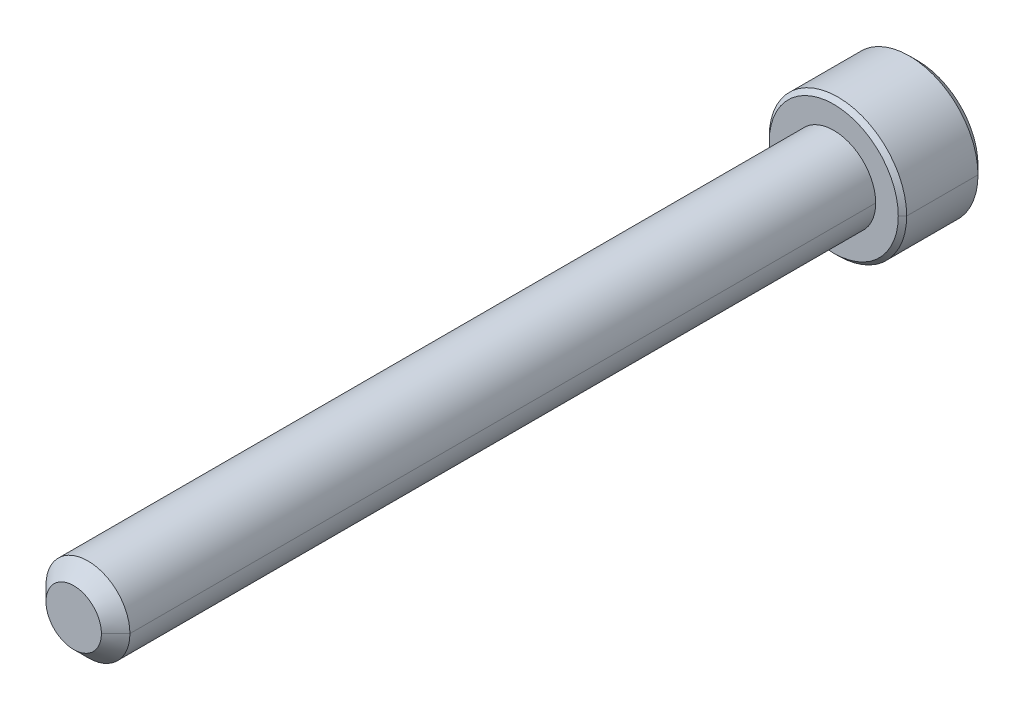
ISO-10303-21;
HEADER;
FILE_DESCRIPTION(('STEP AP214'),'2;1');
FILE_NAME('part.step','',(''),(''),'','','');
FILE_SCHEMA(('AUTOMOTIVE_DESIGN { 1 0 10303 214 1 1 1 1 }'));
ENDSEC;
DATA;
#1=APPLICATION_CONTEXT('core data for automotive mechanical design processes');
#2=APPLICATION_PROTOCOL_DEFINITION('international standard','automotive_design',2000,#1);
#3=PRODUCT_CONTEXT('',#1,'mechanical');
#4=PRODUCT('Part','Part','',(#3));
#5=PRODUCT_RELATED_PRODUCT_CATEGORY('part','',(#4));
#6=PRODUCT_DEFINITION_FORMATION('','',#4);
#7=PRODUCT_DEFINITION_CONTEXT('part definition',#1,'design');
#8=PRODUCT_DEFINITION('design','',#6,#7);
#9=PRODUCT_DEFINITION_SHAPE('','',#8);
#10=(LENGTH_UNIT() NAMED_UNIT(*) SI_UNIT(.MILLI.,.METRE.));
#11=(NAMED_UNIT(*) PLANE_ANGLE_UNIT() SI_UNIT($,.RADIAN.));
#12=(NAMED_UNIT(*) SI_UNIT($,.STERADIAN.) SOLID_ANGLE_UNIT());
#13=UNCERTAINTY_MEASURE_WITH_UNIT(LENGTH_MEASURE(1.E-05),#10,'distance_accuracy_value','');
#14=(GEOMETRIC_REPRESENTATION_CONTEXT(3) GLOBAL_UNCERTAINTY_ASSIGNED_CONTEXT((#13)) GLOBAL_UNIT_ASSIGNED_CONTEXT((#10,
#11,#12)) REPRESENTATION_CONTEXT('',''));
#15=CARTESIAN_POINT('',(0.,0.,0.));
#16=DIRECTION('',(0.,0.,1.));
#17=DIRECTION('',(1.,0.,0.));
#18=AXIS2_PLACEMENT_3D('',#15,#16,#17);
#19=CARTESIAN_POINT('',(0.,0.,-31.92526));
#20=DIRECTION('',(0.,0.,-1.));
#21=DIRECTION('',(-1.,0.,0.));
#22=AXIS2_PLACEMENT_3D('',#19,#20,#21);
#23=CONICAL_SURFACE('',#22,2.8702,0.785398163397448);
#24=DIRECTION('',(0.707106781186547,0.,-0.707106781186548));
#25=VECTOR('',#24,1.);
#26=CARTESIAN_POINT('',(2.8702,0.,-31.92526));
#27=LINE('',#26,#25);
#28=CARTESIAN_POINT('',(2.69494,0.,-31.75));
#29=VERTEX_POINT('',#28);
#30=CARTESIAN_POINT('',(2.8702,0.,-31.92526));
#31=VERTEX_POINT('',#30);
#32=EDGE_CURVE('E162',#29,#31,#27,.T.);
#33=ORIENTED_EDGE('',*,*,#32,.F.);
#34=CARTESIAN_POINT('',(0.,0.,-31.75));
#35=DIRECTION('',(0.,0.,1.));
#36=DIRECTION('',(-1.,0.,0.));
#37=AXIS2_PLACEMENT_3D('',#34,#35,#36);
#38=CIRCLE('',#37,2.69494);
#39=CARTESIAN_POINT('',(-2.69494,0.,-31.75));
#40=VERTEX_POINT('',#39);
#41=EDGE_CURVE('E274',#40,#29,#38,.T.);
#42=ORIENTED_EDGE('',*,*,#41,.F.);
#43=DIRECTION('',(-0.707106781186547,0.,-0.707106781186548));
#44=VECTOR('',#43,1.);
#45=CARTESIAN_POINT('',(-2.8702,0.,-31.92526));
#46=LINE('',#45,#44);
#47=CARTESIAN_POINT('',(-2.8702,0.,-31.92526));
#48=VERTEX_POINT('',#47);
#49=EDGE_CURVE('E165',#40,#48,#46,.T.);
#50=ORIENTED_EDGE('',*,*,#49,.T.);
#51=CARTESIAN_POINT('',(0.,0.,-31.92526));
#52=DIRECTION('',(0.,0.,-1.));
#53=DIRECTION('',(-1.,0.,0.));
#54=AXIS2_PLACEMENT_3D('',#51,#52,#53);
#55=CIRCLE('',#54,2.8702);
#56=EDGE_CURVE('E159',#31,#48,#55,.T.);
#57=ORIENTED_EDGE('',*,*,#56,.F.);
#58=EDGE_LOOP('',(#33,#42,#50,#57));
#59=FACE_BOUND('',#58,.T.);
#60=ADVANCED_FACE('F17',(#59),#23,.T.);
#61=CARTESIAN_POINT('',(0.,0.,-35.2552));
#62=DIRECTION('',(0.,0.,1.));
#63=DIRECTION('',(1.,0.,0.));
#64=AXIS2_PLACEMENT_3D('',#61,#62,#63);
#65=CONICAL_SURFACE('',#64,2.51968,0.785398163397453);
#66=DIRECTION('',(-0.707106781186552,0.,0.707106781186544));
#67=VECTOR('',#66,1.);
#68=CARTESIAN_POINT('',(-2.51968,0.,-35.2552));
#69=LINE('',#68,#67);
#70=CARTESIAN_POINT('',(-2.51968,0.,-35.2552));
#71=VERTEX_POINT('',#70);
#72=CARTESIAN_POINT('',(-2.8702,0.,-34.90468));
#73=VERTEX_POINT('',#72);
#74=EDGE_CURVE('E227',#71,#73,#69,.T.);
#75=ORIENTED_EDGE('',*,*,#74,.F.);
#76=CARTESIAN_POINT('',(0.,0.,-35.2552));
#77=DIRECTION('',(0.,0.,-1.));
#78=DIRECTION('',(-1.,0.,0.));
#79=AXIS2_PLACEMENT_3D('',#76,#77,#78);
#80=CIRCLE('',#79,2.51968);
#81=CARTESIAN_POINT('',(2.51968,0.,-35.2552));
#82=VERTEX_POINT('',#81);
#83=EDGE_CURVE('E171',#82,#71,#80,.T.);
#84=ORIENTED_EDGE('',*,*,#83,.F.);
#85=DIRECTION('',(0.707106781186552,0.,0.707106781186544));
#86=VECTOR('',#85,1.);
#87=CARTESIAN_POINT('',(2.51968,0.,-35.2552));
#88=LINE('',#87,#86);
#89=CARTESIAN_POINT('',(2.8702,0.,-34.90468));
#90=VERTEX_POINT('',#89);
#91=EDGE_CURVE('E211',#82,#90,#88,.T.);
#92=ORIENTED_EDGE('',*,*,#91,.T.);
#93=CARTESIAN_POINT('',(0.,0.,-34.90468));
#94=DIRECTION('',(0.,0.,1.));
#95=DIRECTION('',(-1.,0.,0.));
#96=AXIS2_PLACEMENT_3D('',#93,#94,#95);
#97=CIRCLE('',#96,2.8702);
#98=EDGE_CURVE('E172',#73,#90,#97,.T.);
#99=ORIENTED_EDGE('',*,*,#98,.F.);
#100=EDGE_LOOP('',(#75,#84,#92,#99));
#101=FACE_BOUND('',#100,.T.);
#102=ADVANCED_FACE('F301',(#101),#65,.T.);
#103=CARTESIAN_POINT('',(-1.3890625,0.801975608296216,-33.17160625));
#104=DIRECTION('',(-0.5,0.866025403784439,0.));
#105=DIRECTION('',(0.,0.,1.));
#106=AXIS2_PLACEMENT_3D('',#103,#104,#105);
#107=PLANE('',#106);
#108=DIRECTION('',(0.,0.,-1.));
#109=VECTOR('',#108,1.);
#110=CARTESIAN_POINT('',(-1.3890625,0.801975608296216,-33.17160625));
#111=LINE('',#110,#109);
#112=CARTESIAN_POINT('',(-1.3890625,0.801975608296216,-33.17160625));
#113=VERTEX_POINT('',#112);
#114=CARTESIAN_POINT('',(-1.3890625,0.801975608296217,-35.2552));
#115=VERTEX_POINT('',#114);
#116=EDGE_CURVE('E11',#113,#115,#111,.T.);
#117=ORIENTED_EDGE('',*,*,#116,.T.);
#118=CARTESIAN_POINT('',(-1.3890625,0.801975608296216,-35.2552));
#119=CARTESIAN_POINT('',(-1.01849140004186,1.01592493261094,-35.0412506756853));
#120=CARTESIAN_POINT('',(-0.697089917087232,1.20148616531274,-35.0403144254643));
#121=CARTESIAN_POINT('',(-0.373823774011936,1.38812396003716,-35.0393727434437));
#122=CARTESIAN_POINT('',(0.,1.60395121659243,-35.2552));
#123=B_SPLINE_CURVE_WITH_KNOTS('',2,(#118,#119,#120,#121,#122),.UNSPECIFIED.,.F.,.F.,(3,2,3),
(0.,0.5,1.),.UNSPECIFIED.);
#124=CARTESIAN_POINT('',(0.,1.60395121659243,-35.2552));
#125=VERTEX_POINT('',#124);
#126=EDGE_CURVE('E283',#115,#125,#123,.T.);
#127=ORIENTED_EDGE('',*,*,#126,.T.);
#128=DIRECTION('',(0.,0.,-1.));
#129=VECTOR('',#128,1.);
#130=CARTESIAN_POINT('',(0.,1.60395121659243,-33.17160625));
#131=LINE('',#130,#129);
#132=CARTESIAN_POINT('',(0.,1.60395121659243,-33.17160625));
#133=VERTEX_POINT('',#132);
#134=EDGE_CURVE('E264',#133,#125,#131,.T.);
#135=ORIENTED_EDGE('',*,*,#134,.F.);
#136=DIRECTION('',(0.866025403784439,0.5,0.));
#137=VECTOR('',#136,1.);
#138=CARTESIAN_POINT('',(-1.3890625,0.801975608296216,-33.17160625));
#139=LINE('',#138,#137);
#140=EDGE_CURVE('E254',#113,#133,#139,.T.);
#141=ORIENTED_EDGE('',*,*,#140,.F.);
#142=EDGE_LOOP('',(#117,#127,#135,#141));
#143=FACE_BOUND('',#142,.T.);
#144=ADVANCED_FACE('F290',(#143),#107,.F.);
#145=CARTESIAN_POINT('',(-1.3890625,-0.801975608296215,-33.17160625));
#146=DIRECTION('',(-1.,0.,0.));
#147=DIRECTION('',(0.,0.,1.));
#148=AXIS2_PLACEMENT_3D('',#145,#146,#147);
#149=PLANE('',#148);
#150=DIRECTION('',(0.,0.,-1.));
#151=VECTOR('',#150,1.);
#152=CARTESIAN_POINT('',(-1.3890625,-0.801975608296215,-33.17160625));
#153=LINE('',#152,#151);
#154=CARTESIAN_POINT('',(-1.3890625,-0.801975608296215,-33.17160625));
#155=VERTEX_POINT('',#154);
#156=CARTESIAN_POINT('',(-1.3890625,-0.801975608296215,-35.2552));
#157=VERTEX_POINT('',#156);
#158=EDGE_CURVE('E31',#155,#157,#153,.T.);
#159=ORIENTED_EDGE('',*,*,#158,.T.);
#160=CARTESIAN_POINT('',(-1.3890625,-0.801975608296215,-35.2552));
#161=CARTESIAN_POINT('',(-1.3890625,-0.598835940120913,-35.1536301659123));
#162=CARTESIAN_POINT('',(-1.3890625,-0.412894220509206,-35.1003782690769));
#163=CARTESIAN_POINT('',(-1.3890625,-0.203155990118202,-35.0403112834076));
#164=CARTESIAN_POINT('',(-1.3890625,0.,-35.0403112834076));
#165=B_SPLINE_CURVE_WITH_KNOTS('',2,(#160,#161,#162,#163,#164),.UNSPECIFIED.,.F.,.F.,(3,2,3),
(0.,0.5,1.),.UNSPECIFIED.);
#166=CARTESIAN_POINT('',(-1.3890625,0.,-35.0403112834076));
#167=VERTEX_POINT('',#166);
#168=EDGE_CURVE('E387',#157,#167,#165,.T.);
#169=ORIENTED_EDGE('',*,*,#168,.T.);
#170=CARTESIAN_POINT('',(-1.3890625,0.,-35.0403112834076));
#171=CARTESIAN_POINT('',(-1.3890625,0.200999313304303,-35.0403112834076));
#172=CARTESIAN_POINT('',(-1.3890625,0.412931213470117,-35.1003888097555));
#173=CARTESIAN_POINT('',(-1.3890625,0.596333224734399,-35.1523788082191));
#174=CARTESIAN_POINT('',(-1.3890625,0.801975608296215,-35.2552));
#175=B_SPLINE_CURVE_WITH_KNOTS('',2,(#170,#171,#172,#173,#174),.UNSPECIFIED.,.F.,.F.,(3,2,3),
(0.,0.5,1.),.UNSPECIFIED.);
#176=EDGE_CURVE('E214',#167,#115,#175,.T.);
#177=ORIENTED_EDGE('',*,*,#176,.T.);
#178=ORIENTED_EDGE('',*,*,#116,.F.);
#179=DIRECTION('',(0.,1.,0.));
#180=VECTOR('',#179,1.);
#181=CARTESIAN_POINT('',(-1.3890625,-0.801975608296215,-33.17160625));
#182=LINE('',#181,#180);
#183=EDGE_CURVE('E226',#155,#113,#182,.T.);
#184=ORIENTED_EDGE('',*,*,#183,.F.);
#185=EDGE_LOOP('',(#159,#169,#177,#178,#184));
#186=FACE_BOUND('',#185,.T.);
#187=ADVANCED_FACE('F300',(#186),#149,.F.);
#188=CARTESIAN_POINT('',(0.,-1.60395121659243,-33.17160625));
#189=DIRECTION('',(-0.5,-0.866025403784439,0.));
#190=DIRECTION('',(-0.866025403784439,0.5,0.));
#191=AXIS2_PLACEMENT_3D('',#188,#189,#190);
#192=PLANE('',#191);
#193=DIRECTION('',(0.,0.,-1.));
#194=VECTOR('',#193,1.);
#195=CARTESIAN_POINT('',(0.,-1.60395121659243,-33.17160625));
#196=LINE('',#195,#194);
#197=CARTESIAN_POINT('',(0.,-1.60395121659243,-33.17160625));
#198=VERTEX_POINT('',#197);
#199=CARTESIAN_POINT('',(0.,-1.60395121659243,-35.2552));
#200=VERTEX_POINT('',#199);
#201=EDGE_CURVE('E331',#198,#200,#196,.T.);
#202=ORIENTED_EDGE('',*,*,#201,.T.);
#203=CARTESIAN_POINT('',(0.,-1.60395121659243,-35.2552));
#204=CARTESIAN_POINT('',(-0.370571099953717,-1.39000189228026,-35.0412506756878));
#205=CARTESIAN_POINT('',(-0.691972582912766,-1.2044406595759,-35.0403144254643));
#206=CARTESIAN_POINT('',(-1.01523872598382,-1.01780286485394,-35.0393727434411));
#207=CARTESIAN_POINT('',(-1.3890625,-0.801975608296215,-35.2552));
#208=B_SPLINE_CURVE_WITH_KNOTS('',2,(#203,#204,#205,#206,#207),.UNSPECIFIED.,.F.,.F.,(3,2,3),
(0.,0.5,1.),.UNSPECIFIED.);
#209=EDGE_CURVE('E325',#200,#157,#208,.T.);
#210=ORIENTED_EDGE('',*,*,#209,.T.);
#211=ORIENTED_EDGE('',*,*,#158,.F.);
#212=DIRECTION('',(-0.866025403784439,0.5,0.));
#213=VECTOR('',#212,1.);
#214=CARTESIAN_POINT('',(0.,-1.60395121659243,-33.17160625));
#215=LINE('',#214,#213);
#216=EDGE_CURVE('E222',#198,#155,#215,.T.);
#217=ORIENTED_EDGE('',*,*,#216,.F.);
#218=EDGE_LOOP('',(#202,#210,#211,#217));
#219=FACE_BOUND('',#218,.T.);
#220=ADVANCED_FACE('F304',(#219),#192,.F.);
#221=CARTESIAN_POINT('',(1.3890625,-0.801975608296214,-33.17160625));
#222=DIRECTION('',(0.5,-0.866025403784439,0.));
#223=DIRECTION('',(0.,0.,-1.));
#224=AXIS2_PLACEMENT_3D('',#221,#222,#223);
#225=PLANE('',#224);
#226=DIRECTION('',(0.,0.,-1.));
#227=VECTOR('',#226,1.);
#228=CARTESIAN_POINT('',(1.3890625,-0.801975608296214,-33.17160625));
#229=LINE('',#228,#227);
#230=CARTESIAN_POINT('',(1.3890625,-0.801975608296214,-33.17160625));
#231=VERTEX_POINT('',#230);
#232=CARTESIAN_POINT('',(1.3890625,-0.801975608296215,-35.2552));
#233=VERTEX_POINT('',#232);
#234=EDGE_CURVE('E506',#231,#233,#229,.T.);
#235=ORIENTED_EDGE('',*,*,#234,.T.);
#236=CARTESIAN_POINT('',(1.3890625,-0.801975608296214,-35.2552));
#237=CARTESIAN_POINT('',(1.01849140004626,-1.0159249326084,-35.0412506756878));
#238=CARTESIAN_POINT('',(0.697089917087233,-1.20148616531274,-35.0403144254643));
#239=CARTESIAN_POINT('',(0.373823774016215,-1.38812396003469,-35.0393727434412));
#240=CARTESIAN_POINT('',(0.,-1.60395121659243,-35.2552));
#241=B_SPLINE_CURVE_WITH_KNOTS('',2,(#236,#237,#238,#239,#240),.UNSPECIFIED.,.F.,.F.,(3,2,3),
(0.,0.5,1.),.UNSPECIFIED.);
#242=EDGE_CURVE('E492',#233,#200,#241,.T.);
#243=ORIENTED_EDGE('',*,*,#242,.T.);
#244=ORIENTED_EDGE('',*,*,#201,.F.);
#245=DIRECTION('',(-0.866025403784439,-0.5,0.));
#246=VECTOR('',#245,1.);
#247=CARTESIAN_POINT('',(1.3890625,-0.801975608296214,-33.17160625));
#248=LINE('',#247,#246);
#249=EDGE_CURVE('E220',#231,#198,#248,.T.);
#250=ORIENTED_EDGE('',*,*,#249,.F.);
#251=EDGE_LOOP('',(#235,#243,#244,#250));
#252=FACE_BOUND('',#251,.T.);
#253=ADVANCED_FACE('F308',(#252),#225,.F.);
#254=CARTESIAN_POINT('',(1.3890625,0.801975608296215,-33.17160625));
#255=DIRECTION('',(1.,0.,0.));
#256=DIRECTION('',(0.,-1.,0.));
#257=AXIS2_PLACEMENT_3D('',#254,#255,#256);
#258=PLANE('',#257);
#259=DIRECTION('',(0.,0.,-1.));
#260=VECTOR('',#259,1.);
#261=CARTESIAN_POINT('',(1.3890625,0.801975608296215,-33.17160625));
#262=LINE('',#261,#260);
#263=CARTESIAN_POINT('',(1.3890625,0.801975608296215,-33.17160625));
#264=VERTEX_POINT('',#263);
#265=CARTESIAN_POINT('',(1.3890625,0.801975608296215,-35.2552));
#266=VERTEX_POINT('',#265);
#267=EDGE_CURVE('E374',#264,#266,#262,.T.);
#268=ORIENTED_EDGE('',*,*,#267,.T.);
#269=CARTESIAN_POINT('',(1.3890625,0.801975608296215,-35.2552));
#270=CARTESIAN_POINT('',(1.3890625,0.597923036537972,-35.1531737141209));
#271=CARTESIAN_POINT('',(1.3890625,0.413018690027918,-35.1004137385518));
#272=CARTESIAN_POINT('',(1.3890625,0.202758682275074,-35.0404188650858));
#273=CARTESIAN_POINT('',(1.3890625,0.000183757148265913,-35.040311295562));
#274=CARTESIAN_POINT('',(1.3890625,-0.201412271727737,-35.0402042458431));
#275=CARTESIAN_POINT('',(1.3890625,-0.412807004932099,-35.1003534215298));
#276=CARTESIAN_POINT('',(1.3890625,-0.597234645803845,-35.1528295187538));
#277=CARTESIAN_POINT('',(1.3890625,-0.801975608296215,-35.2552));
#278=B_SPLINE_CURVE_WITH_KNOTS('',2,(#269,#270,#271,#272,#273,#274,#275,#276,#277),
.UNSPECIFIED.,.F.,.F.,(3,2,2,2,3),(0.,0.25,0.5,0.75,1.),.UNSPECIFIED.);
#279=EDGE_CURVE('E521',#266,#233,#278,.T.);
#280=ORIENTED_EDGE('',*,*,#279,.T.);
#281=ORIENTED_EDGE('',*,*,#234,.F.);
#282=DIRECTION('',(0.,-1.,0.));
#283=VECTOR('',#282,1.);
#284=CARTESIAN_POINT('',(1.3890625,0.801975608296215,-33.17160625));
#285=LINE('',#284,#283);
#286=EDGE_CURVE('E216',#264,#231,#285,.T.);
#287=ORIENTED_EDGE('',*,*,#286,.F.);
#288=EDGE_LOOP('',(#268,#280,#281,#287));
#289=FACE_BOUND('',#288,.T.);
#290=ADVANCED_FACE('F348',(#289),#258,.F.);
#291=CARTESIAN_POINT('',(0.,1.60395121659243,-33.17160625));
#292=DIRECTION('',(0.5,0.866025403784439,0.));
#293=DIRECTION('',(0.,0.,-1.));
#294=AXIS2_PLACEMENT_3D('',#291,#292,#293);
#295=PLANE('',#294);
#296=ORIENTED_EDGE('',*,*,#134,.T.);
#297=CARTESIAN_POINT('',(0.,1.60395121659243,-35.2552));
#298=CARTESIAN_POINT('',(0.370571099949375,1.39000189228276,-35.0412506756903));
#299=CARTESIAN_POINT('',(0.691972582912765,1.2044406595759,-35.0403144254643));
#300=CARTESIAN_POINT('',(1.01523872597956,1.0178028648564,-35.0393727434387));
#301=CARTESIAN_POINT('',(1.3890625,0.801975608296215,-35.2552));
#302=B_SPLINE_CURVE_WITH_KNOTS('',2,(#297,#298,#299,#300,#301),.UNSPECIFIED.,.F.,.F.,(3,2,3),
(0.,0.5,1.),.UNSPECIFIED.);
#303=EDGE_CURVE('E277',#125,#266,#302,.T.);
#304=ORIENTED_EDGE('',*,*,#303,.T.);
#305=ORIENTED_EDGE('',*,*,#267,.F.);
#306=DIRECTION('',(0.866025403784439,-0.5,0.));
#307=VECTOR('',#306,1.);
#308=CARTESIAN_POINT('',(0.,1.60395121659243,-33.17160625));
#309=LINE('',#308,#307);
#310=EDGE_CURVE('E221',#133,#264,#309,.T.);
#311=ORIENTED_EDGE('',*,*,#310,.F.);
#312=EDGE_LOOP('',(#296,#304,#305,#311));
#313=FACE_BOUND('',#312,.T.);
#314=ADVANCED_FACE('F555',(#313),#295,.F.);
#315=CARTESIAN_POINT('',(1.3890625,2.40592682488864,-33.17160625));
#316=DIRECTION('',(0.,0.,-1.));
#317=DIRECTION('',(0.,-1.,0.));
#318=AXIS2_PLACEMENT_3D('',#315,#316,#317);
#319=PLANE('',#318);
#320=ORIENTED_EDGE('',*,*,#140,.T.);
#321=ORIENTED_EDGE('',*,*,#310,.T.);
#322=ORIENTED_EDGE('',*,*,#286,.T.);
#323=ORIENTED_EDGE('',*,*,#249,.T.);
#324=ORIENTED_EDGE('',*,*,#216,.T.);
#325=ORIENTED_EDGE('',*,*,#183,.T.);
#326=EDGE_LOOP('',(#320,#321,#322,#323,#324,#325));
#327=FACE_BOUND('',#326,.T.);
#328=ADVANCED_FACE('F346',(#327),#319,.T.);
#329=CARTESIAN_POINT('',(0.,0.,-35.2552));
#330=DIRECTION('',(0.,0.,-1.));
#331=DIRECTION('',(-1.,0.,0.));
#332=AXIS2_PLACEMENT_3D('',#329,#330,#331);
#333=CONICAL_SURFACE('',#332,1.60395121659243,0.78539816339745);
#334=CARTESIAN_POINT('',(0.,0.,-35.2552));
#335=DIRECTION('',(0.,0.,-1.));
#336=DIRECTION('',(-1.,0.,0.));
#337=AXIS2_PLACEMENT_3D('',#334,#335,#336);
#338=CIRCLE('',#337,1.60395121659243);
#339=EDGE_CURVE('E241',#115,#125,#338,.T.);
#340=ORIENTED_EDGE('',*,*,#339,.T.);
#341=ORIENTED_EDGE('',*,*,#126,.F.);
#342=EDGE_LOOP('',(#340,#341));
#343=FACE_BOUND('',#342,.T.);
#344=ADVANCED_FACE('F343',(#343),#333,.F.);
#345=CARTESIAN_POINT('',(0.,0.,-35.2552));
#346=DIRECTION('',(0.,0.,-1.));
#347=DIRECTION('',(-1.,0.,0.));
#348=AXIS2_PLACEMENT_3D('',#345,#346,#347);
#349=CONICAL_SURFACE('',#348,1.60395121659243,0.78539816339745);
#350=DIRECTION('',(-0.707106781186549,0.,-0.707106781186546));
#351=VECTOR('',#350,1.);
#352=CARTESIAN_POINT('',(-1.60395121659243,0.,-35.2552));
#353=LINE('',#352,#351);
#354=CARTESIAN_POINT('',(-1.60395121659243,0.,-35.2552));
#355=VERTEX_POINT('',#354);
#356=EDGE_CURVE('E369',#167,#355,#353,.T.);
#357=ORIENTED_EDGE('',*,*,#356,.F.);
#358=ORIENTED_EDGE('',*,*,#168,.F.);
#359=CARTESIAN_POINT('',(0.,0.,-35.2552));
#360=DIRECTION('',(0.,0.,-1.));
#361=DIRECTION('',(-1.,0.,0.));
#362=AXIS2_PLACEMENT_3D('',#359,#360,#361);
#363=CIRCLE('',#362,1.60395121659243);
#364=EDGE_CURVE('E363',#157,#355,#363,.T.);
#365=ORIENTED_EDGE('',*,*,#364,.T.);
#366=EDGE_LOOP('',(#357,#358,#365));
#367=FACE_BOUND('',#366,.T.);
#368=ADVANCED_FACE('F342',(#367),#349,.F.);
#369=CARTESIAN_POINT('',(0.,0.,-35.2552));
#370=DIRECTION('',(0.,0.,-1.));
#371=DIRECTION('',(-1.,0.,0.));
#372=AXIS2_PLACEMENT_3D('',#369,#370,#371);
#373=CONICAL_SURFACE('',#372,1.60395121659243,0.78539816339745);
#374=CARTESIAN_POINT('',(0.,0.,-35.2552));
#375=DIRECTION('',(0.,0.,-1.));
#376=DIRECTION('',(-1.,0.,0.));
#377=AXIS2_PLACEMENT_3D('',#374,#375,#376);
#378=CIRCLE('',#377,1.60395121659243);
#379=EDGE_CURVE('E464',#200,#157,#378,.T.);
#380=ORIENTED_EDGE('',*,*,#379,.T.);
#381=ORIENTED_EDGE('',*,*,#209,.F.);
#382=EDGE_LOOP('',(#380,#381));
#383=FACE_BOUND('',#382,.T.);
#384=ADVANCED_FACE('F333',(#383),#373,.F.);
#385=CARTESIAN_POINT('',(0.,0.,-35.2552));
#386=DIRECTION('',(0.,0.,-1.));
#387=DIRECTION('',(-1.,0.,0.));
#388=AXIS2_PLACEMENT_3D('',#385,#386,#387);
#389=CONICAL_SURFACE('',#388,1.60395121659243,0.78539816339745);
#390=CARTESIAN_POINT('',(0.,0.,-35.2552));
#391=DIRECTION('',(0.,0.,-1.));
#392=DIRECTION('',(-1.,0.,0.));
#393=AXIS2_PLACEMENT_3D('',#390,#391,#392);
#394=CIRCLE('',#393,1.60395121659243);
#395=EDGE_CURVE('E468',#233,#200,#394,.T.);
#396=ORIENTED_EDGE('',*,*,#395,.T.);
#397=ORIENTED_EDGE('',*,*,#242,.F.);
#398=EDGE_LOOP('',(#396,#397));
#399=FACE_BOUND('',#398,.T.);
#400=ADVANCED_FACE('F19',(#399),#389,.F.);
#401=CARTESIAN_POINT('',(0.,0.,-35.2552));
#402=DIRECTION('',(0.,0.,-1.));
#403=DIRECTION('',(-1.,0.,0.));
#404=AXIS2_PLACEMENT_3D('',#401,#402,#403);
#405=CONICAL_SURFACE('',#404,1.60395121659243,0.78539816339745);
#406=CARTESIAN_POINT('',(0.,0.,-35.2552));
#407=DIRECTION('',(0.,0.,-1.));
#408=DIRECTION('',(-1.,0.,0.));
#409=AXIS2_PLACEMENT_3D('',#406,#407,#408);
#410=CIRCLE('',#409,1.60395121659243);
#411=EDGE_CURVE('E380',#266,#233,#410,.T.);
#412=ORIENTED_EDGE('',*,*,#411,.T.);
#413=ORIENTED_EDGE('',*,*,#279,.F.);
#414=EDGE_LOOP('',(#412,#413));
#415=FACE_BOUND('',#414,.T.);
#416=ADVANCED_FACE('F424',(#415),#405,.F.);
#417=CARTESIAN_POINT('',(0.,0.,-35.2552));
#418=DIRECTION('',(0.,0.,-1.));
#419=DIRECTION('',(-1.,0.,0.));
#420=AXIS2_PLACEMENT_3D('',#417,#418,#419);
#421=CONICAL_SURFACE('',#420,1.60395121659243,0.78539816339745);
#422=CARTESIAN_POINT('',(0.,0.,-35.2552));
#423=DIRECTION('',(0.,0.,-1.));
#424=DIRECTION('',(-1.,0.,0.));
#425=AXIS2_PLACEMENT_3D('',#422,#423,#424);
#426=CIRCLE('',#425,1.60395121659243);
#427=EDGE_CURVE('E278',#125,#266,#426,.T.);
#428=ORIENTED_EDGE('',*,*,#427,.T.);
#429=ORIENTED_EDGE('',*,*,#303,.F.);
#430=EDGE_LOOP('',(#428,#429));
#431=FACE_BOUND('',#430,.T.);
#432=ADVANCED_FACE('F419',(#431),#421,.F.);
#433=CARTESIAN_POINT('',(0.,0.,-31.75));
#434=DIRECTION('',(0.,0.,-1.));
#435=DIRECTION('',(0.,-1.,0.));
#436=AXIS2_PLACEMENT_3D('',#433,#434,#435);
#437=PLANE('',#436);
#438=CARTESIAN_POINT('',(0.,0.,-31.75));
#439=DIRECTION('',(0.,0.,1.));
#440=DIRECTION('',(-1.,0.,0.));
#441=AXIS2_PLACEMENT_3D('',#438,#439,#440);
#442=CIRCLE('',#441,1.7526);
#443=CARTESIAN_POINT('',(1.7526,0.,-31.75));
#444=VERTEX_POINT('',#443);
#445=CARTESIAN_POINT('',(-1.7526,0.,-31.75));
#446=VERTEX_POINT('',#445);
#447=EDGE_CURVE('E203',#444,#446,#442,.T.);
#448=ORIENTED_EDGE('',*,*,#447,.F.);
#449=CARTESIAN_POINT('',(0.,0.,-31.75));
#450=DIRECTION('',(0.,0.,1.));
#451=DIRECTION('',(-1.,0.,0.));
#452=AXIS2_PLACEMENT_3D('',#449,#450,#451);
#453=CIRCLE('',#452,1.7526);
#454=EDGE_CURVE('E247',#446,#444,#453,.T.);
#455=ORIENTED_EDGE('',*,*,#454,.F.);
#456=EDGE_LOOP('',(#448,#455));
#457=FACE_BOUND('',#456,.T.);
#458=ORIENTED_EDGE('',*,*,#41,.T.);
#459=CARTESIAN_POINT('',(0.,0.,-31.75));
#460=DIRECTION('',(0.,0.,1.));
#461=DIRECTION('',(-1.,0.,0.));
#462=AXIS2_PLACEMENT_3D('',#459,#460,#461);
#463=CIRCLE('',#462,2.69494);
#464=EDGE_CURVE('E193',#29,#40,#463,.T.);
#465=ORIENTED_EDGE('',*,*,#464,.T.);
#466=EDGE_LOOP('',(#458,#465));
#467=FACE_BOUND('',#466,.T.);
#468=ADVANCED_FACE('F423',(#457,#467),#437,.F.);
#469=CARTESIAN_POINT('',(0.,0.,-35.2552));
#470=DIRECTION('',(0.,0.,-1.));
#471=DIRECTION('',(0.,-1.,0.));
#472=AXIS2_PLACEMENT_3D('',#469,#470,#471);
#473=PLANE('',#472);
#474=ORIENTED_EDGE('',*,*,#339,.F.);
#475=CARTESIAN_POINT('',(0.,0.,-35.2552));
#476=DIRECTION('',(0.,0.,-1.));
#477=DIRECTION('',(-1.,0.,0.));
#478=AXIS2_PLACEMENT_3D('',#475,#476,#477);
#479=CIRCLE('',#478,1.60395121659243);
#480=EDGE_CURVE('E273',#355,#115,#479,.T.);
#481=ORIENTED_EDGE('',*,*,#480,.F.);
#482=ORIENTED_EDGE('',*,*,#364,.F.);
#483=ORIENTED_EDGE('',*,*,#379,.F.);
#484=ORIENTED_EDGE('',*,*,#395,.F.);
#485=ORIENTED_EDGE('',*,*,#411,.F.);
#486=ORIENTED_EDGE('',*,*,#427,.F.);
#487=EDGE_LOOP('',(#474,#481,#482,#483,#484,#485,#486));
#488=FACE_BOUND('',#487,.T.);
#489=ORIENTED_EDGE('',*,*,#83,.T.);
#490=CARTESIAN_POINT('',(0.,0.,-35.2552));
#491=DIRECTION('',(0.,0.,-1.));
#492=DIRECTION('',(-1.,0.,0.));
#493=AXIS2_PLACEMENT_3D('',#490,#491,#492);
#494=CIRCLE('',#493,2.51968);
#495=EDGE_CURVE('E231',#71,#82,#494,.T.);
#496=ORIENTED_EDGE('',*,*,#495,.T.);
#497=EDGE_LOOP('',(#489,#496));
#498=FACE_BOUND('',#497,.T.);
#499=ADVANCED_FACE('F577',(#488,#498),#473,.T.);
#500=CARTESIAN_POINT('',(0.,0.,-35.2552));
#501=DIRECTION('',(0.,0.,1.));
#502=DIRECTION('',(1.,0.,0.));
#503=AXIS2_PLACEMENT_3D('',#500,#501,#502);
#504=CYLINDRICAL_SURFACE('',#503,2.8702);
#505=DIRECTION('',(0.,0.,1.));
#506=VECTOR('',#505,1.);
#507=CARTESIAN_POINT('',(-2.8702,0.,-35.2552));
#508=LINE('',#507,#506);
#509=EDGE_CURVE('E184',#73,#48,#508,.T.);
#510=ORIENTED_EDGE('',*,*,#509,.F.);
#511=ORIENTED_EDGE('',*,*,#98,.T.);
#512=DIRECTION('',(0.,0.,1.));
#513=VECTOR('',#512,1.);
#514=CARTESIAN_POINT('',(2.8702,0.,-35.2552));
#515=LINE('',#514,#513);
#516=EDGE_CURVE('E175',#90,#31,#515,.T.);
#517=ORIENTED_EDGE('',*,*,#516,.T.);
#518=ORIENTED_EDGE('',*,*,#56,.T.);
#519=EDGE_LOOP('',(#510,#511,#517,#518));
#520=FACE_BOUND('',#519,.T.);
#521=ADVANCED_FACE('F177',(#520),#504,.T.);
#522=CARTESIAN_POINT('',(0.,0.,0.));
#523=DIRECTION('',(0.,0.,-1.));
#524=DIRECTION('',(-1.,0.,0.));
#525=AXIS2_PLACEMENT_3D('',#522,#523,#524);
#526=CONICAL_SURFACE('',#525,1.1572875,0.785398163397446);
#527=DIRECTION('',(0.707106781186546,0.,-0.70710678118655));
#528=VECTOR('',#527,1.);
#529=CARTESIAN_POINT('',(1.1572875,0.,0.));
#530=LINE('',#529,#528);
#531=CARTESIAN_POINT('',(1.1572875,0.,0.));
#532=VERTEX_POINT('',#531);
#533=CARTESIAN_POINT('',(1.7526,0.,-0.595312500000007));
#534=VERTEX_POINT('',#533);
#535=EDGE_CURVE('E210',#532,#534,#530,.T.);
#536=ORIENTED_EDGE('',*,*,#535,.F.);
#537=CARTESIAN_POINT('',(0.,0.,0.));
#538=DIRECTION('',(0.,0.,1.));
#539=DIRECTION('',(1.,0.,0.));
#540=AXIS2_PLACEMENT_3D('',#537,#538,#539);
#541=CIRCLE('',#540,1.1572875);
#542=CARTESIAN_POINT('',(-1.1572875,0.,0.));
#543=VERTEX_POINT('',#542);
#544=EDGE_CURVE('E136',#543,#532,#541,.T.);
#545=ORIENTED_EDGE('',*,*,#544,.F.);
#546=DIRECTION('',(-0.707106781186546,0.,-0.70710678118655));
#547=VECTOR('',#546,1.);
#548=CARTESIAN_POINT('',(-1.1572875,0.,0.));
#549=LINE('',#548,#547);
#550=CARTESIAN_POINT('',(-1.7526,0.,-0.595312500000007));
#551=VERTEX_POINT('',#550);
#552=EDGE_CURVE('E209',#543,#551,#549,.T.);
#553=ORIENTED_EDGE('',*,*,#552,.T.);
#554=CARTESIAN_POINT('',(0.,0.,-0.595312500000007));
#555=DIRECTION('',(0.,0.,-1.));
#556=DIRECTION('',(1.,0.,0.));
#557=AXIS2_PLACEMENT_3D('',#554,#555,#556);
#558=CIRCLE('',#557,1.7526);
#559=EDGE_CURVE('E244',#534,#551,#558,.T.);
#560=ORIENTED_EDGE('',*,*,#559,.F.);
#561=EDGE_LOOP('',(#536,#545,#553,#560));
#562=FACE_BOUND('',#561,.T.);
#563=ADVANCED_FACE('F605',(#562),#526,.T.);
#564=CARTESIAN_POINT('',(0.,0.,0.));
#565=DIRECTION('',(0.,0.,1.));
#566=DIRECTION('',(1.,0.,0.));
#567=AXIS2_PLACEMENT_3D('',#564,#565,#566);
#568=PLANE('',#567);
#569=ORIENTED_EDGE('',*,*,#544,.T.);
#570=CARTESIAN_POINT('',(0.,0.,0.));
#571=DIRECTION('',(0.,0.,1.));
#572=DIRECTION('',(1.,0.,0.));
#573=AXIS2_PLACEMENT_3D('',#570,#571,#572);
#574=CIRCLE('',#573,1.1572875);
#575=EDGE_CURVE('E183',#532,#543,#574,.T.);
#576=ORIENTED_EDGE('',*,*,#575,.T.);
#577=EDGE_LOOP('',(#569,#576));
#578=FACE_BOUND('',#577,.T.);
#579=ADVANCED_FACE('F553',(#578),#568,.T.);
#580=CARTESIAN_POINT('',(0.,0.,-31.75));
#581=DIRECTION('',(0.,0.,1.));
#582=DIRECTION('',(1.,0.,0.));
#583=AXIS2_PLACEMENT_3D('',#580,#581,#582);
#584=CYLINDRICAL_SURFACE('',#583,1.7526);
#585=DIRECTION('',(0.,0.,1.));
#586=VECTOR('',#585,1.);
#587=CARTESIAN_POINT('',(-1.7526,0.,-31.75));
#588=LINE('',#587,#586);
#589=EDGE_CURVE('E234',#446,#551,#588,.T.);
#590=ORIENTED_EDGE('',*,*,#589,.F.);
#591=ORIENTED_EDGE('',*,*,#454,.T.);
#592=DIRECTION('',(0.,0.,1.));
#593=VECTOR('',#592,1.);
#594=CARTESIAN_POINT('',(1.7526,0.,-31.75));
#595=LINE('',#594,#593);
#596=EDGE_CURVE('E237',#444,#534,#595,.T.);
#597=ORIENTED_EDGE('',*,*,#596,.T.);
#598=ORIENTED_EDGE('',*,*,#559,.T.);
#599=EDGE_LOOP('',(#590,#591,#597,#598));
#600=FACE_BOUND('',#599,.T.);
#601=ADVANCED_FACE('F550',(#600),#584,.T.);
#602=CARTESIAN_POINT('',(0.,0.,-31.75));
#603=DIRECTION('',(0.,0.,1.));
#604=DIRECTION('',(1.,0.,0.));
#605=AXIS2_PLACEMENT_3D('',#602,#603,#604);
#606=CYLINDRICAL_SURFACE('',#605,1.7526);
#607=ORIENTED_EDGE('',*,*,#447,.T.);
#608=ORIENTED_EDGE('',*,*,#589,.T.);
#609=CARTESIAN_POINT('',(0.,0.,-0.595312500000007));
#610=DIRECTION('',(0.,0.,-1.));
#611=DIRECTION('',(1.,0.,0.));
#612=AXIS2_PLACEMENT_3D('',#609,#610,#611);
#613=CIRCLE('',#612,1.7526);
#614=EDGE_CURVE('E205',#551,#534,#613,.T.);
#615=ORIENTED_EDGE('',*,*,#614,.T.);
#616=ORIENTED_EDGE('',*,*,#596,.F.);
#617=EDGE_LOOP('',(#607,#608,#615,#616));
#618=FACE_BOUND('',#617,.T.);
#619=ADVANCED_FACE('F548',(#618),#606,.T.);
#620=CARTESIAN_POINT('',(0.,0.,0.));
#621=DIRECTION('',(0.,0.,-1.));
#622=DIRECTION('',(-1.,0.,0.));
#623=AXIS2_PLACEMENT_3D('',#620,#621,#622);
#624=CONICAL_SURFACE('',#623,1.1572875,0.785398163397446);
#625=ORIENTED_EDGE('',*,*,#575,.F.);
#626=ORIENTED_EDGE('',*,*,#535,.T.);
#627=ORIENTED_EDGE('',*,*,#614,.F.);
#628=ORIENTED_EDGE('',*,*,#552,.F.);
#629=EDGE_LOOP('',(#625,#626,#627,#628));
#630=FACE_BOUND('',#629,.T.);
#631=ADVANCED_FACE('F545',(#630),#624,.T.);
#632=CARTESIAN_POINT('',(0.,0.,-35.2552));
#633=DIRECTION('',(0.,0.,1.));
#634=DIRECTION('',(1.,0.,0.));
#635=AXIS2_PLACEMENT_3D('',#632,#633,#634);
#636=CYLINDRICAL_SURFACE('',#635,2.8702);
#637=CARTESIAN_POINT('',(0.,0.,-34.90468));
#638=DIRECTION('',(0.,0.,1.));
#639=DIRECTION('',(-1.,0.,0.));
#640=AXIS2_PLACEMENT_3D('',#637,#638,#639);
#641=CIRCLE('',#640,2.8702);
#642=EDGE_CURVE('E215',#90,#73,#641,.T.);
#643=ORIENTED_EDGE('',*,*,#642,.T.);
#644=ORIENTED_EDGE('',*,*,#509,.T.);
#645=CARTESIAN_POINT('',(0.,0.,-31.92526));
#646=DIRECTION('',(0.,0.,-1.));
#647=DIRECTION('',(-1.,0.,0.));
#648=AXIS2_PLACEMENT_3D('',#645,#646,#647);
#649=CIRCLE('',#648,2.8702);
#650=EDGE_CURVE('E186',#48,#31,#649,.T.);
#651=ORIENTED_EDGE('',*,*,#650,.T.);
#652=ORIENTED_EDGE('',*,*,#516,.F.);
#653=EDGE_LOOP('',(#643,#644,#651,#652));
#654=FACE_BOUND('',#653,.T.);
#655=ADVANCED_FACE('F187',(#654),#636,.T.);
#656=CARTESIAN_POINT('',(0.,0.,-35.2552));
#657=DIRECTION('',(0.,0.,-1.));
#658=DIRECTION('',(-1.,0.,0.));
#659=AXIS2_PLACEMENT_3D('',#656,#657,#658);
#660=CONICAL_SURFACE('',#659,1.60395121659243,0.78539816339745);
#661=ORIENTED_EDGE('',*,*,#176,.F.);
#662=ORIENTED_EDGE('',*,*,#356,.T.);
#663=ORIENTED_EDGE('',*,*,#480,.T.);
#664=EDGE_LOOP('',(#661,#662,#663));
#665=FACE_BOUND('',#664,.T.);
#666=ADVANCED_FACE('F417',(#665),#660,.F.);
#667=CARTESIAN_POINT('',(0.,0.,-35.2552));
#668=DIRECTION('',(0.,0.,1.));
#669=DIRECTION('',(1.,0.,0.));
#670=AXIS2_PLACEMENT_3D('',#667,#668,#669);
#671=CONICAL_SURFACE('',#670,2.51968,0.785398163397453);
#672=ORIENTED_EDGE('',*,*,#495,.F.);
#673=ORIENTED_EDGE('',*,*,#74,.T.);
#674=ORIENTED_EDGE('',*,*,#642,.F.);
#675=ORIENTED_EDGE('',*,*,#91,.F.);
#676=EDGE_LOOP('',(#672,#673,#674,#675));
#677=FACE_BOUND('',#676,.T.);
#678=ADVANCED_FACE('F414',(#677),#671,.T.);
#679=CARTESIAN_POINT('',(0.,0.,-31.92526));
#680=DIRECTION('',(0.,0.,-1.));
#681=DIRECTION('',(-1.,0.,0.));
#682=AXIS2_PLACEMENT_3D('',#679,#680,#681);
#683=CONICAL_SURFACE('',#682,2.8702,0.785398163397448);
#684=ORIENTED_EDGE('',*,*,#464,.F.);
#685=ORIENTED_EDGE('',*,*,#32,.T.);
#686=ORIENTED_EDGE('',*,*,#650,.F.);
#687=ORIENTED_EDGE('',*,*,#49,.F.);
#688=EDGE_LOOP('',(#684,#685,#686,#687));
#689=FACE_BOUND('',#688,.T.);
#690=ADVANCED_FACE('F191',(#689),#683,.T.);
#691=CLOSED_SHELL('',(#60,#102,#144,#187,#220,#253,#290,#314,#328,#344,#368,#384,#400,#416,#432,
#468,#499,#521,#563,#579,#601,#619,#631,#655,#666,#678,#690));
#692=MANIFOLD_SOLID_BREP('B1',#691);
#693=ADVANCED_BREP_SHAPE_REPRESENTATION('',(#18,#692),#14);
#694=SHAPE_DEFINITION_REPRESENTATION(#9,#693);
ENDSEC;
END-ISO-10303-21;
